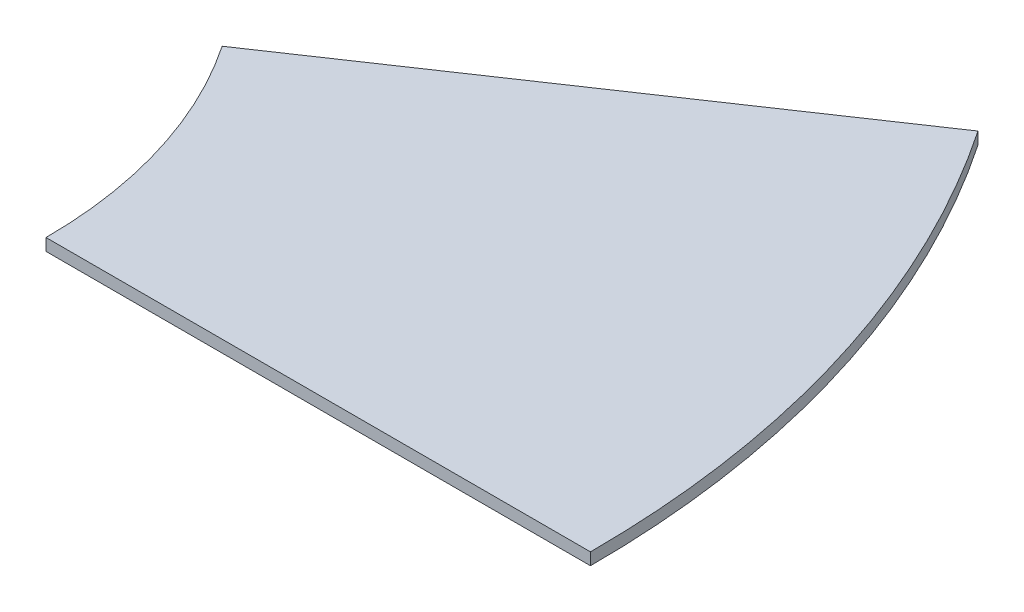
ISO-10303-21;
HEADER;
FILE_DESCRIPTION(('STEP AP214'),'2;1');
FILE_NAME('part.step','',(''),(''),'','','');
FILE_SCHEMA(('AUTOMOTIVE_DESIGN { 1 0 10303 214 1 1 1 1 }'));
ENDSEC;
DATA;
#1=APPLICATION_CONTEXT('core data for automotive mechanical design processes');
#2=APPLICATION_PROTOCOL_DEFINITION('international standard','automotive_design',2000,#1);
#3=PRODUCT_CONTEXT('',#1,'mechanical');
#4=PRODUCT('Part','Part','',(#3));
#5=PRODUCT_RELATED_PRODUCT_CATEGORY('part','',(#4));
#6=PRODUCT_DEFINITION_FORMATION('','',#4);
#7=PRODUCT_DEFINITION_CONTEXT('part definition',#1,'design');
#8=PRODUCT_DEFINITION('design','',#6,#7);
#9=PRODUCT_DEFINITION_SHAPE('','',#8);
#10=(LENGTH_UNIT() NAMED_UNIT(*) SI_UNIT(.MILLI.,.METRE.));
#11=(NAMED_UNIT(*) PLANE_ANGLE_UNIT() SI_UNIT($,.RADIAN.));
#12=(NAMED_UNIT(*) SI_UNIT($,.STERADIAN.) SOLID_ANGLE_UNIT());
#13=UNCERTAINTY_MEASURE_WITH_UNIT(LENGTH_MEASURE(1.E-05),#10,'distance_accuracy_value','');
#14=(GEOMETRIC_REPRESENTATION_CONTEXT(3) GLOBAL_UNCERTAINTY_ASSIGNED_CONTEXT((#13)) GLOBAL_UNIT_ASSIGNED_CONTEXT((#10,
#11,#12)) REPRESENTATION_CONTEXT('',''));
#15=CARTESIAN_POINT('',(0.,0.,0.));
#16=DIRECTION('',(0.,0.,1.));
#17=DIRECTION('',(1.,0.,0.));
#18=AXIS2_PLACEMENT_3D('',#15,#16,#17);
#19=CARTESIAN_POINT('',(0.,1.33,0.));
#20=DIRECTION('',(0.,-1.,0.));
#21=DIRECTION('',(0.,0.,-1.));
#22=AXIS2_PLACEMENT_3D('',#19,#20,#21);
#23=CYLINDRICAL_SURFACE('',#22,110.);
#24=CARTESIAN_POINT('',(0.,0.,0.));
#25=DIRECTION('',(0.,1.,0.));
#26=DIRECTION('',(0.,0.,1.));
#27=AXIS2_PLACEMENT_3D('',#24,#25,#26);
#28=CIRCLE('',#27,110.);
#29=CARTESIAN_POINT('',(110.,0.,0.));
#30=VERTEX_POINT('',#29);
#31=CARTESIAN_POINT('',(91.1941329810549,0.,-61.5112193817816));
#32=VERTEX_POINT('',#31);
#33=EDGE_CURVE('E97',#30,#32,#28,.T.);
#34=ORIENTED_EDGE('',*,*,#33,.T.);
#35=DIRECTION('',(0.,-1.,0.));
#36=VECTOR('',#35,1.);
#37=CARTESIAN_POINT('',(91.1941329810549,1.33,-61.5112193817816));
#38=LINE('',#37,#36);
#39=CARTESIAN_POINT('',(91.1941329810549,1.33,-61.5112193817816));
#40=VERTEX_POINT('',#39);
#41=EDGE_CURVE('E11',#40,#32,#38,.T.);
#42=ORIENTED_EDGE('',*,*,#41,.F.);
#43=CARTESIAN_POINT('',(0.,1.33,0.));
#44=DIRECTION('',(0.,1.,0.));
#45=DIRECTION('',(0.,0.,1.));
#46=AXIS2_PLACEMENT_3D('',#43,#44,#45);
#47=CIRCLE('',#46,110.);
#48=CARTESIAN_POINT('',(110.,1.33,0.));
#49=VERTEX_POINT('',#48);
#50=EDGE_CURVE('E83',#49,#40,#47,.T.);
#51=ORIENTED_EDGE('',*,*,#50,.F.);
#52=DIRECTION('',(0.,-1.,0.));
#53=VECTOR('',#52,1.);
#54=CARTESIAN_POINT('',(110.,1.33,0.));
#55=LINE('',#54,#53);
#56=EDGE_CURVE('E50',#49,#30,#55,.T.);
#57=ORIENTED_EDGE('',*,*,#56,.T.);
#58=EDGE_LOOP('',(#34,#42,#51,#57));
#59=FACE_BOUND('',#58,.T.);
#60=ADVANCED_FACE('F34',(#59),#23,.T.);
#61=CARTESIAN_POINT('',(91.1941329810549,1.33,-61.5112193817816));
#62=DIRECTION('',(0.559192903470742,0.,0.829037572555045));
#63=DIRECTION('',(0.829037572555045,0.,-0.559192903470742));
#64=AXIS2_PLACEMENT_3D('',#61,#62,#63);
#65=PLANE('',#64);
#66=DIRECTION('',(-0.829037572555045,0.,0.559192903470742));
#67=VECTOR('',#66,1.);
#68=CARTESIAN_POINT('',(91.1941329810549,0.,-61.5112193817816));
#69=LINE('',#68,#67);
#70=CARTESIAN_POINT('',(41.4518786277522,0.,-27.9596451735371));
#71=VERTEX_POINT('',#70);
#72=EDGE_CURVE('E88',#32,#71,#69,.T.);
#73=ORIENTED_EDGE('',*,*,#72,.T.);
#74=DIRECTION('',(0.,-1.,0.));
#75=VECTOR('',#74,1.);
#76=CARTESIAN_POINT('',(41.4518786277522,1.33,-27.9596451735371));
#77=LINE('',#76,#75);
#78=CARTESIAN_POINT('',(41.4518786277522,1.33,-27.9596451735371));
#79=VERTEX_POINT('',#78);
#80=EDGE_CURVE('E42',#79,#71,#77,.T.);
#81=ORIENTED_EDGE('',*,*,#80,.F.);
#82=DIRECTION('',(-0.829037572555045,0.,0.559192903470742));
#83=VECTOR('',#82,1.);
#84=CARTESIAN_POINT('',(91.1941329810549,1.33,-61.5112193817816));
#85=LINE('',#84,#83);
#86=EDGE_CURVE('E75',#40,#79,#85,.T.);
#87=ORIENTED_EDGE('',*,*,#86,.F.);
#88=ORIENTED_EDGE('',*,*,#41,.T.);
#89=EDGE_LOOP('',(#73,#81,#87,#88));
#90=FACE_BOUND('',#89,.T.);
#91=ADVANCED_FACE('F87',(#90),#65,.F.);
#92=CARTESIAN_POINT('',(0.,1.33,0.));
#93=DIRECTION('',(0.,-1.,0.));
#94=DIRECTION('',(0.,0.,-1.));
#95=AXIS2_PLACEMENT_3D('',#92,#93,#94);
#96=CYLINDRICAL_SURFACE('',#95,50.);
#97=CARTESIAN_POINT('',(0.,0.,0.));
#98=DIRECTION('',(0.,1.,0.));
#99=DIRECTION('',(0.,0.,1.));
#100=AXIS2_PLACEMENT_3D('',#97,#98,#99);
#101=CIRCLE('',#100,50.);
#102=CARTESIAN_POINT('',(50.,0.,0.));
#103=VERTEX_POINT('',#102);
#104=EDGE_CURVE('E100',#103,#71,#101,.T.);
#105=ORIENTED_EDGE('',*,*,#104,.F.);
#106=DIRECTION('',(0.,-1.,0.));
#107=VECTOR('',#106,1.);
#108=CARTESIAN_POINT('',(50.,1.33,0.));
#109=LINE('',#108,#107);
#110=CARTESIAN_POINT('',(50.,1.33,0.));
#111=VERTEX_POINT('',#110);
#112=EDGE_CURVE('E64',#111,#103,#109,.T.);
#113=ORIENTED_EDGE('',*,*,#112,.F.);
#114=CARTESIAN_POINT('',(0.,1.33,0.));
#115=DIRECTION('',(0.,1.,0.));
#116=DIRECTION('',(0.,0.,1.));
#117=AXIS2_PLACEMENT_3D('',#114,#115,#116);
#118=CIRCLE('',#117,50.);
#119=EDGE_CURVE('E82',#111,#79,#118,.T.);
#120=ORIENTED_EDGE('',*,*,#119,.T.);
#121=ORIENTED_EDGE('',*,*,#80,.T.);
#122=EDGE_LOOP('',(#105,#113,#120,#121));
#123=FACE_BOUND('',#122,.T.);
#124=ADVANCED_FACE('F91',(#123),#96,.F.);
#125=CARTESIAN_POINT('',(110.,1.33,0.));
#126=DIRECTION('',(0.,0.,1.));
#127=DIRECTION('',(1.,0.,0.));
#128=AXIS2_PLACEMENT_3D('',#125,#126,#127);
#129=PLANE('',#128);
#130=DIRECTION('',(-1.,0.,0.));
#131=VECTOR('',#130,1.);
#132=CARTESIAN_POINT('',(110.,0.,0.));
#133=LINE('',#132,#131);
#134=EDGE_CURVE('E102',#30,#103,#133,.T.);
#135=ORIENTED_EDGE('',*,*,#134,.F.);
#136=ORIENTED_EDGE('',*,*,#56,.F.);
#137=DIRECTION('',(-1.,0.,0.));
#138=VECTOR('',#137,1.);
#139=CARTESIAN_POINT('',(110.,1.33,0.));
#140=LINE('',#139,#138);
#141=EDGE_CURVE('E92',#49,#111,#140,.T.);
#142=ORIENTED_EDGE('',*,*,#141,.T.);
#143=ORIENTED_EDGE('',*,*,#112,.T.);
#144=EDGE_LOOP('',(#135,#136,#142,#143));
#145=FACE_BOUND('',#144,.T.);
#146=ADVANCED_FACE('F108',(#145),#129,.T.);
#147=CARTESIAN_POINT('',(0.,1.33,0.));
#148=DIRECTION('',(0.,1.,0.));
#149=DIRECTION('',(0.,0.,1.));
#150=AXIS2_PLACEMENT_3D('',#147,#148,#149);
#151=PLANE('',#150);
#152=ORIENTED_EDGE('',*,*,#50,.T.);
#153=ORIENTED_EDGE('',*,*,#86,.T.);
#154=ORIENTED_EDGE('',*,*,#119,.F.);
#155=ORIENTED_EDGE('',*,*,#141,.F.);
#156=EDGE_LOOP('',(#152,#153,#154,#155));
#157=FACE_BOUND('',#156,.T.);
#158=ADVANCED_FACE('F79',(#157),#151,.T.);
#159=CARTESIAN_POINT('',(0.,0.,0.));
#160=DIRECTION('',(0.,1.,0.));
#161=DIRECTION('',(0.,0.,1.));
#162=AXIS2_PLACEMENT_3D('',#159,#160,#161);
#163=PLANE('',#162);
#164=ORIENTED_EDGE('',*,*,#33,.F.);
#165=ORIENTED_EDGE('',*,*,#134,.T.);
#166=ORIENTED_EDGE('',*,*,#104,.T.);
#167=ORIENTED_EDGE('',*,*,#72,.F.);
#168=EDGE_LOOP('',(#164,#165,#166,#167));
#169=FACE_BOUND('',#168,.T.);
#170=ADVANCED_FACE('F107',(#169),#163,.F.);
#171=CLOSED_SHELL('',(#60,#91,#124,#146,#158,#170));
#172=MANIFOLD_SOLID_BREP('B2',#171);
#173=ADVANCED_BREP_SHAPE_REPRESENTATION('',(#18,#172),#14);
#174=SHAPE_DEFINITION_REPRESENTATION(#9,#173);
ENDSEC;
END-ISO-10303-21;
